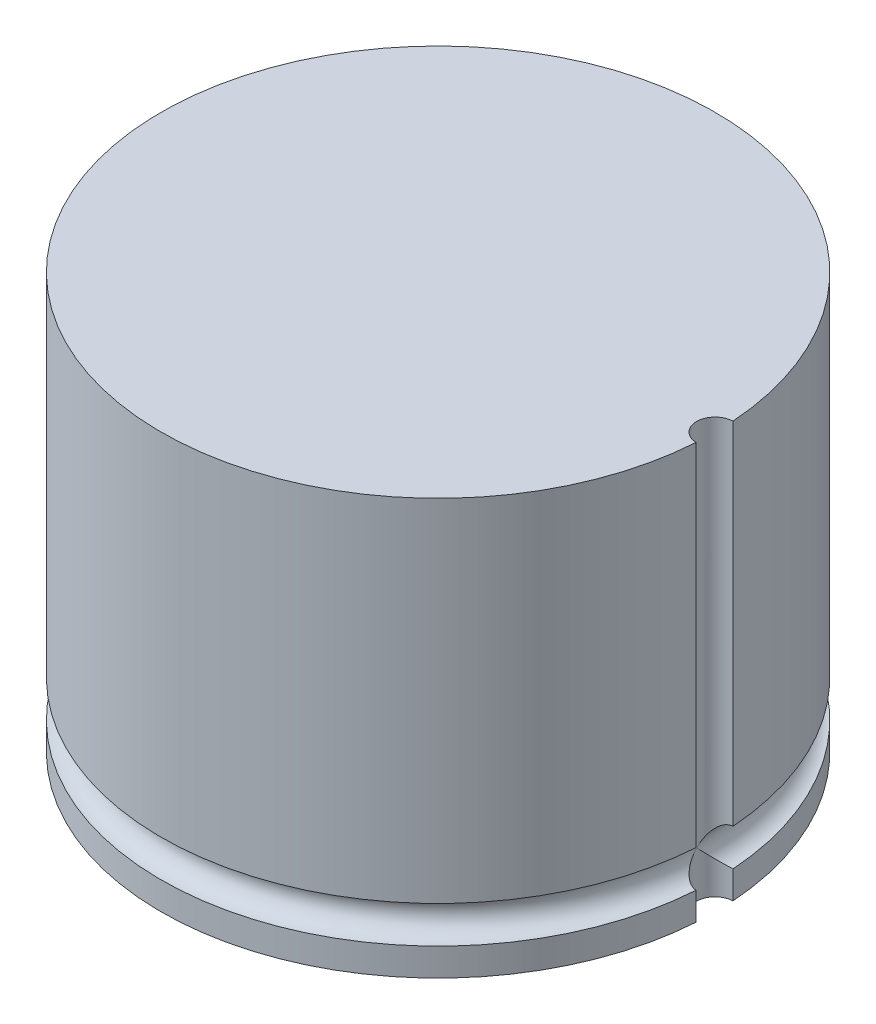
ISO-10303-21;
HEADER;
FILE_DESCRIPTION(('STEP AP214'),'2;1');
FILE_NAME('part.step','',(''),(''),'','','');
FILE_SCHEMA(('AUTOMOTIVE_DESIGN { 1 0 10303 214 1 1 1 1 }'));
ENDSEC;
DATA;
#1=APPLICATION_CONTEXT('core data for automotive mechanical design processes');
#2=APPLICATION_PROTOCOL_DEFINITION('international standard','automotive_design',2000,#1);
#3=PRODUCT_CONTEXT('',#1,'mechanical');
#4=PRODUCT('Part','Part','',(#3));
#5=PRODUCT_RELATED_PRODUCT_CATEGORY('part','',(#4));
#6=PRODUCT_DEFINITION_FORMATION('','',#4);
#7=PRODUCT_DEFINITION_CONTEXT('part definition',#1,'design');
#8=PRODUCT_DEFINITION('design','',#6,#7);
#9=PRODUCT_DEFINITION_SHAPE('','',#8);
#10=(LENGTH_UNIT() NAMED_UNIT(*) SI_UNIT(.MILLI.,.METRE.));
#11=(NAMED_UNIT(*) PLANE_ANGLE_UNIT() SI_UNIT($,.RADIAN.));
#12=(NAMED_UNIT(*) SI_UNIT($,.STERADIAN.) SOLID_ANGLE_UNIT());
#13=UNCERTAINTY_MEASURE_WITH_UNIT(LENGTH_MEASURE(1.E-05),#10,'distance_accuracy_value','');
#14=(GEOMETRIC_REPRESENTATION_CONTEXT(3) GLOBAL_UNCERTAINTY_ASSIGNED_CONTEXT((#13)) GLOBAL_UNIT_ASSIGNED_CONTEXT((#10,
#11,#12)) REPRESENTATION_CONTEXT('',''));
#15=CARTESIAN_POINT('',(0.,0.,0.));
#16=DIRECTION('',(0.,0.,1.));
#17=DIRECTION('',(1.,0.,0.));
#18=AXIS2_PLACEMENT_3D('',#15,#16,#17);
#19=CARTESIAN_POINT('',(0.,0.,0.));
#20=DIRECTION('',(0.,1.,0.));
#21=DIRECTION('',(0.,0.,1.));
#22=AXIS2_PLACEMENT_3D('',#19,#20,#21);
#23=PLANE('',#22);
#24=CARTESIAN_POINT('',(5.,0.,0.));
#25=DIRECTION('',(0.,1.,0.));
#26=DIRECTION('',(0.,0.,1.));
#27=AXIS2_PLACEMENT_3D('',#24,#25,#26);
#28=CIRCLE('',#27,1.);
#29=CARTESIAN_POINT('',(5.,0.,1.));
#30=VERTEX_POINT('',#29);
#31=EDGE_CURVE('E93',#30,#30,#28,.F.);
#32=ORIENTED_EDGE('',*,*,#31,.F.);
#33=EDGE_LOOP('',(#32));
#34=FACE_BOUND('',#33,.T.);
#35=CARTESIAN_POINT('',(0.,0.,0.));
#36=DIRECTION('',(0.,1.,0.));
#37=DIRECTION('',(0.,0.,1.));
#38=AXIS2_PLACEMENT_3D('',#35,#36,#37);
#39=CIRCLE('',#38,30.);
#40=CARTESIAN_POINT('',(29.9333333333333,0.,-1.99888858007533));
#41=VERTEX_POINT('',#40);
#42=CARTESIAN_POINT('',(29.9333333333333,0.,1.99888858007533));
#43=VERTEX_POINT('',#42);
#44=EDGE_CURVE('E94',#41,#43,#39,.T.);
#45=ORIENTED_EDGE('',*,*,#44,.F.);
#46=CARTESIAN_POINT('',(30.,0.,0.));
#47=DIRECTION('',(0.,-1.,0.));
#48=DIRECTION('',(0.,0.,-1.));
#49=AXIS2_PLACEMENT_3D('',#46,#47,#48);
#50=CIRCLE('',#49,2.);
#51=EDGE_CURVE('E84',#43,#41,#50,.T.);
#52=ORIENTED_EDGE('',*,*,#51,.F.);
#53=EDGE_LOOP('',(#45,#52));
#54=FACE_BOUND('',#53,.T.);
#55=CARTESIAN_POINT('',(-5.,0.,0.));
#56=DIRECTION('',(0.,1.,0.));
#57=DIRECTION('',(0.,0.,1.));
#58=AXIS2_PLACEMENT_3D('',#55,#56,#57);
#59=CIRCLE('',#58,1.);
#60=CARTESIAN_POINT('',(-5.,0.,1.));
#61=VERTEX_POINT('',#60);
#62=EDGE_CURVE('E97',#61,#61,#59,.F.);
#63=ORIENTED_EDGE('',*,*,#62,.F.);
#64=EDGE_LOOP('',(#63));
#65=FACE_BOUND('',#64,.T.);
#66=ADVANCED_FACE('F35',(#34,#54,#65),#23,.F.);
#67=CARTESIAN_POINT('',(0.,45.,0.));
#68=DIRECTION('',(0.,-1.,0.));
#69=DIRECTION('',(0.,0.,-1.));
#70=AXIS2_PLACEMENT_3D('',#67,#68,#69);
#71=CYLINDRICAL_SURFACE('',#70,30.);
#72=ORIENTED_EDGE('',*,*,#44,.T.);
#73=DIRECTION('',(0.,-1.,0.));
#74=VECTOR('',#73,1.);
#75=CARTESIAN_POINT('',(29.9333333333333,22.5,1.99888858007533));
#76=LINE('',#75,#74);
#77=CARTESIAN_POINT('',(29.9333333333331,2.99999999999999,1.99888858007532));
#78=VERTEX_POINT('',#77);
#79=EDGE_CURVE('E116',#43,#78,#76,.F.);
#80=ORIENTED_EDGE('',*,*,#79,.T.);
#81=CARTESIAN_POINT('',(0.,2.99999999999999,0.));
#82=DIRECTION('',(0.,1.,0.));
#83=DIRECTION('',(0.,0.,1.));
#84=AXIS2_PLACEMENT_3D('',#81,#82,#83);
#85=CIRCLE('',#84,30.);
#86=CARTESIAN_POINT('',(29.9333333333523,2.99999999999999,-1.99888858007596));
#87=VERTEX_POINT('',#86);
#88=EDGE_CURVE('E100',#87,#78,#85,.T.);
#89=ORIENTED_EDGE('',*,*,#88,.F.);
#90=DIRECTION('',(0.,-1.,0.));
#91=VECTOR('',#90,1.);
#92=CARTESIAN_POINT('',(29.9333333333333,22.5,-1.99888858007533));
#93=LINE('',#92,#91);
#94=EDGE_CURVE('E58',#87,#41,#93,.T.);
#95=ORIENTED_EDGE('',*,*,#94,.T.);
#96=EDGE_LOOP('',(#72,#80,#89,#95));
#97=FACE_BOUND('',#96,.T.);
#98=ADVANCED_FACE('F37',(#97),#71,.T.);
#99=CARTESIAN_POINT('',(0.,5.,0.));
#100=DIRECTION('',(0.,-1.,0.));
#101=DIRECTION('',(0.,0.,-1.));
#102=AXIS2_PLACEMENT_3D('',#99,#100,#101);
#103=TOROIDAL_SURFACE('',#102,30.,2.);
#104=CARTESIAN_POINT('',(30.0002,6.9988843855783,1.99999999));
#105=CARTESIAN_POINT('',(29.9565056253033,7.00035175264192,2.0000149243274));
#106=CARTESIAN_POINT('',(29.9127668081772,7.00037503487693,1.99857714595833));
#107=CARTESIAN_POINT('',(29.8255914214189,6.9975621403988,1.9928566311034));
#108=CARTESIAN_POINT('',(29.7821547003861,6.99472751834687,1.98857544182663));
#109=CARTESIAN_POINT('',(29.6962604803278,6.98626199335508,1.97727243175765));
#110=CARTESIAN_POINT('',(29.6537980011182,6.98065293306765,1.97027210920541));
#111=CARTESIAN_POINT('',(29.5698430582245,6.9667546308163,1.95366300694782));
#112=CARTESIAN_POINT('',(29.5283506657306,6.95846519280943,1.9440540364541));
#113=CARTESIAN_POINT('',(29.4059231445429,6.92980759848354,1.91158818803147));
#114=CARTESIAN_POINT('',(29.3268000013171,6.90562571857196,1.88505990422954));
#115=CARTESIAN_POINT('',(29.1751131751675,6.84855040668936,1.82381270102578));
#116=CARTESIAN_POINT('',(29.1025624029556,6.81564030645514,1.78907812409022));
#117=CARTESIAN_POINT('',(28.9394519092198,6.72925108651135,1.69906270791738));
#118=CARTESIAN_POINT('',(28.8521136514017,6.67266183663042,1.64092810291948));
#119=CARTESIAN_POINT('',(28.691586840619,6.54979328793404,1.51606301142116));
#120=CARTESIAN_POINT('',(28.6184260095931,6.48349544079038,1.44931610075037));
#121=CARTESIAN_POINT('',(28.4582760437907,6.31531325861525,1.28123374217331));
#122=CARTESIAN_POINT('',(28.3779794183128,6.21000914383495,1.17696504607821));
#123=CARTESIAN_POINT('',(28.2417032570727,5.99107529746465,0.961598695612035));
#124=CARTESIAN_POINT('',(28.1857652266016,5.87743173798222,0.850489750679044));
#125=CARTESIAN_POINT('',(28.0936057439205,5.63887022589304,0.618171401725263));
#126=CARTESIAN_POINT('',(28.0586650492057,5.51367736126987,0.496744918797056));
#127=CARTESIAN_POINT('',(28.0120826190954,5.26108765716621,0.252238559816224));
#128=CARTESIAN_POINT('',(28.0003912042683,5.13369610511948,0.129162776201549));
#129=CARTESIAN_POINT('',(28.0000032264699,5.00428841118392,0.00414299893364346));
#130=CARTESIAN_POINT('',(28.0000000084938,5.00214418415306,0.00207147877447402));
#131=CARTESIAN_POINT('',(28.,4.99999999999998,0.));
#132=B_SPLINE_CURVE_WITH_KNOTS('',3,(#104,#105,#106,#107,#108,#109,#110,#111,#112,#113,#114,
#115,#116,#117,#118,#119,#120,#121,#122,#123,#124,#125,#126,#127,#128,#129,#130,#131),
.UNSPECIFIED.,.F.,.F.,(4,2,2,2,2,2,2,2,2,2,2,2,2,4),(0.,0.131102772536633,0.262134265401119,
0.392150207862187,0.522175661846874,0.781513105597229,1.04134941688312,1.39697883759747,
1.75329677547288,2.2561962723207,2.75994935222336,3.29193601326314,3.82278468997483,
3.83172896709622),.UNSPECIFIED.);
#133=CARTESIAN_POINT('',(29.9333333333333,7.00000000000001,1.99888858007533));
#134=VERTEX_POINT('',#133);
#135=CARTESIAN_POINT('',(28.,4.99999999999998,0.));
#136=VERTEX_POINT('',#135);
#137=EDGE_CURVE('E113',#134,#136,#132,.T.);
#138=ORIENTED_EDGE('',*,*,#137,.F.);
#139=CARTESIAN_POINT('',(0.,7.,0.));
#140=DIRECTION('',(0.,-1.,0.));
#141=DIRECTION('',(0.,0.,-1.));
#142=AXIS2_PLACEMENT_3D('',#139,#140,#141);
#143=CIRCLE('',#142,30.);
#144=CARTESIAN_POINT('',(29.9333333333333,7.,-1.99888858007533));
#145=VERTEX_POINT('',#144);
#146=EDGE_CURVE('E91',#134,#145,#143,.T.);
#147=ORIENTED_EDGE('',*,*,#146,.T.);
#148=CARTESIAN_POINT('',(28.,4.99999999999998,0.));
#149=CARTESIAN_POINT('',(28.0000000107233,5.00214414898643,-0.00207144463938419));
#150=CARTESIAN_POINT('',(28.0000032286246,5.00428837636287,-0.00414296508863758));
#151=CARTESIAN_POINT('',(28.0004920840107,5.16740047205982,-0.161724310836368));
#152=CARTESIAN_POINT('',(28.0190559464898,5.32876788892809,-0.317626831490741));
#153=CARTESIAN_POINT('',(28.0750293502995,5.56692149212157,-0.548430559267058));
#154=CARTESIAN_POINT('',(28.0984330793182,5.64577517771854,-0.624972619992758));
#155=CARTESIAN_POINT('',(28.1550974460144,5.80144325317164,-0.776443265639755));
#156=CARTESIAN_POINT('',(28.188351589682,5.87825895035813,-0.851372878786941));
#157=CARTESIAN_POINT('',(28.2770204634603,6.05191622008479,-1.02134058497482));
#158=CARTESIAN_POINT('',(28.3360997239628,6.14773380074469,-1.11555469440408));
#159=CARTESIAN_POINT('',(28.4735830629261,6.33138913825711,-1.29730174830021));
#160=CARTESIAN_POINT('',(28.5519449086134,6.41924376774944,-1.38484875356692));
#161=CARTESIAN_POINT('',(28.7074612768462,6.56248210312449,-1.52892199999456));
#162=CARTESIAN_POINT('',(28.7800433953046,6.62049965490312,-1.58773957298894));
#163=CARTESIAN_POINT('',(28.9373777946699,6.72725737685973,-1.69704870847142));
#164=CARTESIAN_POINT('',(29.0221149382856,6.77600891347849,-1.74755046151187));
#165=CARTESIAN_POINT('',(29.1851784182453,6.85276603300412,-1.82828524937747));
#166=CARTESIAN_POINT('',(29.261455046771,6.88296790034891,-1.86055158934463));
#167=CARTESIAN_POINT('',(29.4202081258551,6.93374913731131,-1.91595315823735));
#168=CARTESIAN_POINT('',(29.5026726122519,6.95434654750443,-1.93910549364126));
#169=CARTESIAN_POINT('',(29.654227648075,6.98145199054316,-1.97107397337518));
#170=CARTESIAN_POINT('',(29.7225361648608,6.98999844891576,-1.98186949752107));
#171=CARTESIAN_POINT('',(29.8260397531153,6.99741568646987,-1.99272469195269));
#172=CARTESIAN_POINT('',(29.8607911411966,6.99898517755451,-1.99545348702414));
#173=CARTESIAN_POINT('',(29.9304350774507,7.00030245563491,-1.9990944860936));
#174=CARTESIAN_POINT('',(29.9653276693012,7.00004962771281,-2.00000607676714));
#175=CARTESIAN_POINT('',(30.0002,6.9988843855783,-1.99999999));
#176=B_SPLINE_CURVE_WITH_KNOTS('',3,(#148,#149,#150,#151,#152,#153,#154,#155,#156,#157,#158,
#159,#160,#161,#162,#163,#164,#165,#166,#167,#168,#169,#170,#171,#172,#173,#174,#175),
.UNSPECIFIED.,.F.,.F.,(4,2,2,2,2,2,2,2,2,2,2,2,2,4),(0.,0.00894427712131248,0.680371658867212,
1.01712700670165,1.35366083657469,1.79266293160517,2.23071194997248,2.55951876566918,
2.88791959982722,3.15133322178135,3.41425004639999,3.62252959786436,3.72712534799487,
3.83175639425272),.UNSPECIFIED.);
#177=EDGE_CURVE('E50',#136,#145,#176,.T.);
#178=ORIENTED_EDGE('',*,*,#177,.F.);
#179=CARTESIAN_POINT('',(30.0002,3.0011156144217,-1.99999999));
#180=CARTESIAN_POINT('',(29.9565056253033,2.99964824735808,-2.0000149243274));
#181=CARTESIAN_POINT('',(29.9127668081772,2.99962496512307,-1.99857714595833));
#182=CARTESIAN_POINT('',(29.8255914214189,3.00243785960119,-1.9928566311034));
#183=CARTESIAN_POINT('',(29.7821547003861,3.00527248165312,-1.98857544182663));
#184=CARTESIAN_POINT('',(29.6962604803278,3.01373800664492,-1.97727243175765));
#185=CARTESIAN_POINT('',(29.6537980011182,3.01934706693234,-1.97027210920541));
#186=CARTESIAN_POINT('',(29.5698430582245,3.03324536918369,-1.95366300694782));
#187=CARTESIAN_POINT('',(29.5283506657306,3.04153480719057,-1.9440540364541));
#188=CARTESIAN_POINT('',(29.4059231445429,3.07019240151646,-1.91158818803147));
#189=CARTESIAN_POINT('',(29.3268000013171,3.09437428142804,-1.88505990422954));
#190=CARTESIAN_POINT('',(29.1751131751675,3.15144959331063,-1.82381270102578));
#191=CARTESIAN_POINT('',(29.1025624029556,3.18435969354486,-1.78907812409022));
#192=CARTESIAN_POINT('',(28.9394519092197,3.27074891348865,-1.69906270791737));
#193=CARTESIAN_POINT('',(28.8521136514017,3.32733816336958,-1.64092810291947));
#194=CARTESIAN_POINT('',(28.691586840619,3.45020671206596,-1.51606301142115));
#195=CARTESIAN_POINT('',(28.6184260095931,3.51650455920963,-1.44931610075035));
#196=CARTESIAN_POINT('',(28.4582760437907,3.68468674138476,-1.28123374217329));
#197=CARTESIAN_POINT('',(28.3779794183128,3.78999085616507,-1.1769650460782));
#198=CARTESIAN_POINT('',(28.2417032570727,4.00892470253536,-0.961598695612005));
#199=CARTESIAN_POINT('',(28.1857652266016,4.12256826201777,-0.85048975067899));
#200=CARTESIAN_POINT('',(28.0936057439205,4.36112977410702,-0.618171401725281));
#201=CARTESIAN_POINT('',(28.0586650492057,4.48632263873026,-0.496744918797175));
#202=CARTESIAN_POINT('',(28.0120826190954,4.73891234283366,-0.252238559816097));
#203=CARTESIAN_POINT('',(28.0003912042683,4.86630389488005,-0.129162776201075));
#204=CARTESIAN_POINT('',(28.0000032264699,4.99571158881603,-0.00414299893362795));
#205=CARTESIAN_POINT('',(28.0000000084938,4.9978558158469,-0.00207147877446615));
#206=CARTESIAN_POINT('',(28.,4.99999999999998,0.));
#207=B_SPLINE_CURVE_WITH_KNOTS('',3,(#179,#180,#181,#182,#183,#184,#185,#186,#187,#188,#189,
#190,#191,#192,#193,#194,#195,#196,#197,#198,#199,#200,#201,#202,#203,#204,#205,#206),
.UNSPECIFIED.,.F.,.F.,(4,2,2,2,2,2,2,2,2,2,2,2,2,4),(0.,0.131102772536637,0.262134265401126,
0.392150207862194,0.522175661846882,0.781513105597237,1.04134941688313,1.39697883759748,
1.7532967754729,2.25619627232073,2.75994935222339,3.29193601326315,3.82278468997481,
3.8317289670962),.UNSPECIFIED.);
#208=EDGE_CURVE('E115',#87,#136,#207,.T.);
#209=ORIENTED_EDGE('',*,*,#208,.F.);
#210=ORIENTED_EDGE('',*,*,#88,.T.);
#211=CARTESIAN_POINT('',(28.,4.99999999999998,0.));
#212=CARTESIAN_POINT('',(28.0000000107233,4.99785585101353,0.00207144463938418));
#213=CARTESIAN_POINT('',(28.0000032286246,4.9957116236371,0.00414296508863758));
#214=CARTESIAN_POINT('',(28.0004920840107,4.83259952794015,0.161724310836368));
#215=CARTESIAN_POINT('',(28.0190559464898,4.67123211107188,0.317626831490752));
#216=CARTESIAN_POINT('',(28.0750293502995,4.43307850787841,0.548430559267073));
#217=CARTESIAN_POINT('',(28.0984330793182,4.35422482228144,0.624972619992771));
#218=CARTESIAN_POINT('',(28.1550974460144,4.19855674682834,0.776443265639767));
#219=CARTESIAN_POINT('',(28.188351589682,4.12174104964185,0.851372878786953));
#220=CARTESIAN_POINT('',(28.2770204634603,3.94808377991519,1.02134058497484));
#221=CARTESIAN_POINT('',(28.3360997239628,3.85226619925529,1.1155546944041));
#222=CARTESIAN_POINT('',(28.4735830629261,3.66861086174287,1.29730174830022));
#223=CARTESIAN_POINT('',(28.5519449086134,3.58075623225055,1.38484875356693));
#224=CARTESIAN_POINT('',(28.7074612768462,3.4375178968755,1.52892199999457));
#225=CARTESIAN_POINT('',(28.7800433953046,3.37950034509687,1.58773957298894));
#226=CARTESIAN_POINT('',(28.9373777946699,3.27274262314025,1.69704870847142));
#227=CARTESIAN_POINT('',(29.0221149382856,3.2239910865215,1.74755046151187));
#228=CARTESIAN_POINT('',(29.1851784182453,3.14723396699587,1.82828524937747));
#229=CARTESIAN_POINT('',(29.2614550467711,3.11703209965108,1.86055158934463));
#230=CARTESIAN_POINT('',(29.4202081258551,3.06625086268868,1.91595315823735));
#231=CARTESIAN_POINT('',(29.5026726122519,3.04565345249556,1.93910549364126));
#232=CARTESIAN_POINT('',(29.6542276480751,3.01854800945683,1.97107397337518));
#233=CARTESIAN_POINT('',(29.7225361648608,3.01000155108424,1.98186949752107));
#234=CARTESIAN_POINT('',(29.8260397531153,3.00258431353013,1.99272469195269));
#235=CARTESIAN_POINT('',(29.8607911411966,3.00101482244548,1.99545348702414));
#236=CARTESIAN_POINT('',(29.9304350774507,2.99969754436509,1.9990944860936));
#237=CARTESIAN_POINT('',(29.9653276693012,2.99995037228718,2.00000607676714));
#238=CARTESIAN_POINT('',(30.0002,3.0011156144217,1.99999999));
#239=B_SPLINE_CURVE_WITH_KNOTS('',3,(#211,#212,#213,#214,#215,#216,#217,#218,#219,#220,#221,
#222,#223,#224,#225,#226,#227,#228,#229,#230,#231,#232,#233,#234,#235,#236,#237,#238),
.UNSPECIFIED.,.F.,.F.,(4,2,2,2,2,2,2,2,2,2,2,2,2,4),(0.,0.00894427712131248,0.680371658867211,
1.01712700670165,1.35366083657469,1.79266293160517,2.23071194997247,2.55951876566917,
2.88791959982721,3.15133322178134,3.41425004639998,3.62252959786435,3.72712534799486,
3.8317563942527),.UNSPECIFIED.);
#240=EDGE_CURVE('E114',#136,#78,#239,.T.);
#241=ORIENTED_EDGE('',*,*,#240,.F.);
#242=EDGE_LOOP('',(#138,#147,#178,#209,#210,#241));
#243=FACE_BOUND('',#242,.T.);
#244=ADVANCED_FACE('F111',(#243),#103,.F.);
#245=CARTESIAN_POINT('',(0.,45.,0.));
#246=DIRECTION('',(0.,1.,0.));
#247=DIRECTION('',(0.,0.,1.));
#248=AXIS2_PLACEMENT_3D('',#245,#246,#247);
#249=PLANE('',#248);
#250=CARTESIAN_POINT('',(30.,45.,0.));
#251=DIRECTION('',(0.,-1.,0.));
#252=DIRECTION('',(0.,0.,-1.));
#253=AXIS2_PLACEMENT_3D('',#250,#251,#252);
#254=CIRCLE('',#253,2.);
#255=CARTESIAN_POINT('',(29.9333333333333,45.,1.99888858007533));
#256=VERTEX_POINT('',#255);
#257=CARTESIAN_POINT('',(29.9333333333333,45.,-1.99888858007533));
#258=VERTEX_POINT('',#257);
#259=EDGE_CURVE('E78',#256,#258,#254,.T.);
#260=ORIENTED_EDGE('',*,*,#259,.T.);
#261=CARTESIAN_POINT('',(0.,45.,0.));
#262=DIRECTION('',(0.,1.,0.));
#263=DIRECTION('',(0.,0.,1.));
#264=AXIS2_PLACEMENT_3D('',#261,#262,#263);
#265=CIRCLE('',#264,30.);
#266=EDGE_CURVE('E89',#258,#256,#265,.T.);
#267=ORIENTED_EDGE('',*,*,#266,.T.);
#268=EDGE_LOOP('',(#260,#267));
#269=FACE_BOUND('',#268,.T.);
#270=ADVANCED_FACE('F92',(#269),#249,.T.);
#271=ORIENTED_EDGE('',*,*,#146,.F.);
#272=DIRECTION('',(0.,-1.,0.));
#273=VECTOR('',#272,1.);
#274=CARTESIAN_POINT('',(29.9333333333333,22.5,1.99888858007533));
#275=LINE('',#274,#273);
#276=EDGE_CURVE('E11',#134,#256,#275,.F.);
#277=ORIENTED_EDGE('',*,*,#276,.T.);
#278=ORIENTED_EDGE('',*,*,#266,.F.);
#279=DIRECTION('',(0.,-1.,0.));
#280=VECTOR('',#279,1.);
#281=CARTESIAN_POINT('',(29.9333333333333,22.5,-1.99888858007533));
#282=LINE('',#281,#280);
#283=EDGE_CURVE('E43',#258,#145,#282,.T.);
#284=ORIENTED_EDGE('',*,*,#283,.T.);
#285=EDGE_LOOP('',(#271,#277,#278,#284));
#286=FACE_BOUND('',#285,.T.);
#287=ADVANCED_FACE('F88',(#286),#71,.T.);
#288=CARTESIAN_POINT('',(5.,-6.,0.));
#289=DIRECTION('',(0.,1.,0.));
#290=DIRECTION('',(0.,0.,1.));
#291=AXIS2_PLACEMENT_3D('',#288,#289,#290);
#292=CYLINDRICAL_SURFACE('',#291,1.);
#293=CARTESIAN_POINT('',(5.,-6.,0.));
#294=DIRECTION('',(0.,-1.,0.));
#295=DIRECTION('',(0.,0.,-1.));
#296=AXIS2_PLACEMENT_3D('',#293,#294,#295);
#297=CIRCLE('',#296,1.);
#298=CARTESIAN_POINT('',(5.,-6.,-1.));
#299=VERTEX_POINT('',#298);
#300=EDGE_CURVE('E103',#299,#299,#297,.T.);
#301=ORIENTED_EDGE('',*,*,#300,.F.);
#302=EDGE_LOOP('',(#301));
#303=FACE_BOUND('',#302,.T.);
#304=ORIENTED_EDGE('',*,*,#31,.T.);
#305=EDGE_LOOP('',(#304));
#306=FACE_BOUND('',#305,.T.);
#307=ADVANCED_FACE('F170',(#303,#306),#292,.T.);
#308=CARTESIAN_POINT('',(0.,-6.,0.));
#309=DIRECTION('',(0.,-1.,0.));
#310=DIRECTION('',(0.,0.,-1.));
#311=AXIS2_PLACEMENT_3D('',#308,#309,#310);
#312=PLANE('',#311);
#313=ORIENTED_EDGE('',*,*,#300,.T.);
#314=EDGE_LOOP('',(#313));
#315=FACE_BOUND('',#314,.T.);
#316=ADVANCED_FACE('F163',(#315),#312,.T.);
#317=CARTESIAN_POINT('',(-5.,-6.,0.));
#318=DIRECTION('',(0.,1.,0.));
#319=DIRECTION('',(0.,0.,1.));
#320=AXIS2_PLACEMENT_3D('',#317,#318,#319);
#321=CYLINDRICAL_SURFACE('',#320,1.);
#322=CARTESIAN_POINT('',(-5.,-6.,0.));
#323=DIRECTION('',(0.,-1.,0.));
#324=DIRECTION('',(0.,0.,-1.));
#325=AXIS2_PLACEMENT_3D('',#322,#323,#324);
#326=CIRCLE('',#325,1.);
#327=CARTESIAN_POINT('',(-5.,-6.,-1.));
#328=VERTEX_POINT('',#327);
#329=EDGE_CURVE('E175',#328,#328,#326,.T.);
#330=ORIENTED_EDGE('',*,*,#329,.F.);
#331=EDGE_LOOP('',(#330));
#332=FACE_BOUND('',#331,.T.);
#333=ORIENTED_EDGE('',*,*,#62,.T.);
#334=EDGE_LOOP('',(#333));
#335=FACE_BOUND('',#334,.T.);
#336=ADVANCED_FACE('F139',(#332,#335),#321,.T.);
#337=CARTESIAN_POINT('',(-5.,-6.,0.));
#338=DIRECTION('',(0.,-1.,0.));
#339=DIRECTION('',(0.,0.,-1.));
#340=AXIS2_PLACEMENT_3D('',#337,#338,#339);
#341=PLANE('',#340);
#342=ORIENTED_EDGE('',*,*,#329,.T.);
#343=EDGE_LOOP('',(#342));
#344=FACE_BOUND('',#343,.T.);
#345=ADVANCED_FACE('F138',(#344),#341,.T.);
#346=CARTESIAN_POINT('',(30.,45.,0.));
#347=DIRECTION('',(0.,-1.,0.));
#348=DIRECTION('',(0.,0.,-1.));
#349=AXIS2_PLACEMENT_3D('',#346,#347,#348);
#350=CYLINDRICAL_SURFACE('',#349,2.);
#351=ORIENTED_EDGE('',*,*,#137,.T.);
#352=ORIENTED_EDGE('',*,*,#177,.T.);
#353=ORIENTED_EDGE('',*,*,#283,.F.);
#354=ORIENTED_EDGE('',*,*,#259,.F.);
#355=ORIENTED_EDGE('',*,*,#276,.F.);
#356=EDGE_LOOP('',(#351,#352,#353,#354,#355));
#357=FACE_BOUND('',#356,.T.);
#358=ADVANCED_FACE('F79',(#357),#350,.F.);
#359=ORIENTED_EDGE('',*,*,#208,.T.);
#360=ORIENTED_EDGE('',*,*,#240,.T.);
#361=ORIENTED_EDGE('',*,*,#79,.F.);
#362=ORIENTED_EDGE('',*,*,#51,.T.);
#363=ORIENTED_EDGE('',*,*,#94,.F.);
#364=EDGE_LOOP('',(#359,#360,#361,#362,#363));
#365=FACE_BOUND('',#364,.T.);
#366=ADVANCED_FACE('F137',(#365),#350,.F.);
#367=CLOSED_SHELL('',(#66,#98,#244,#270,#287,#307,#316,#336,#345,#358,#366));
#368=MANIFOLD_SOLID_BREP('B2',#367);
#369=ADVANCED_BREP_SHAPE_REPRESENTATION('',(#18,#368),#14);
#370=SHAPE_DEFINITION_REPRESENTATION(#9,#369);
ENDSEC;
END-ISO-10303-21;
